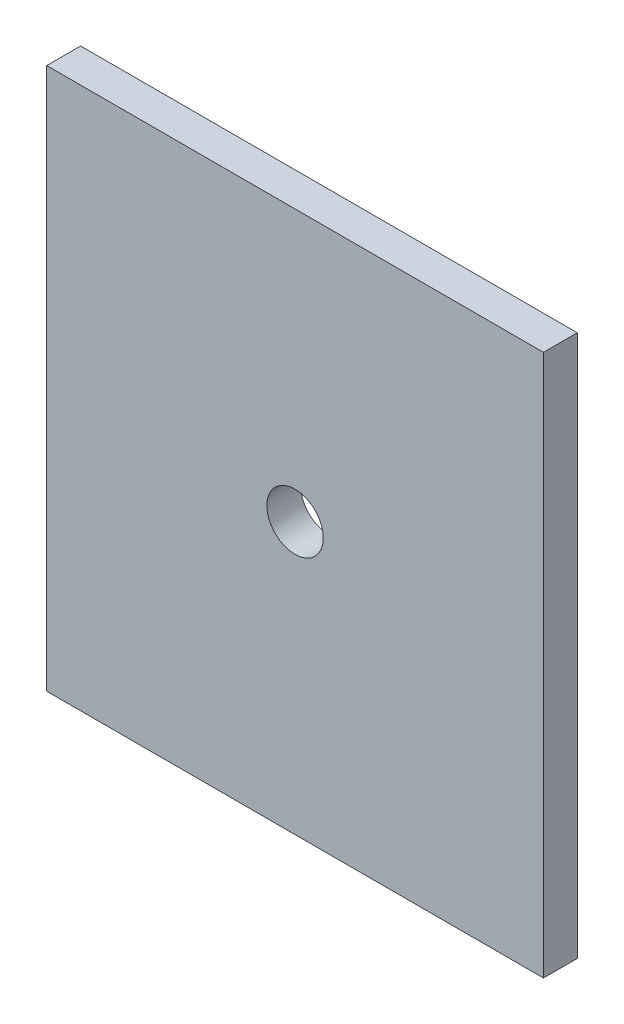
ISO-10303-21;
HEADER;
FILE_DESCRIPTION(('STEP AP214'),'2;1');
FILE_NAME('part.step','',(''),(''),'','','');
FILE_SCHEMA(('AUTOMOTIVE_DESIGN { 1 0 10303 214 1 1 1 1 }'));
ENDSEC;
DATA;
#1=APPLICATION_CONTEXT('core data for automotive mechanical design processes');
#2=APPLICATION_PROTOCOL_DEFINITION('international standard','automotive_design',2000,#1);
#3=PRODUCT_CONTEXT('',#1,'mechanical');
#4=PRODUCT('Part','Part','',(#3));
#5=PRODUCT_RELATED_PRODUCT_CATEGORY('part','',(#4));
#6=PRODUCT_DEFINITION_FORMATION('','',#4);
#7=PRODUCT_DEFINITION_CONTEXT('part definition',#1,'design');
#8=PRODUCT_DEFINITION('design','',#6,#7);
#9=PRODUCT_DEFINITION_SHAPE('','',#8);
#10=(LENGTH_UNIT() NAMED_UNIT(*) SI_UNIT(.MILLI.,.METRE.));
#11=(NAMED_UNIT(*) PLANE_ANGLE_UNIT() SI_UNIT($,.RADIAN.));
#12=(NAMED_UNIT(*) SI_UNIT($,.STERADIAN.) SOLID_ANGLE_UNIT());
#13=UNCERTAINTY_MEASURE_WITH_UNIT(LENGTH_MEASURE(1.E-05),#10,'distance_accuracy_value','');
#14=(GEOMETRIC_REPRESENTATION_CONTEXT(3) GLOBAL_UNCERTAINTY_ASSIGNED_CONTEXT((#13)) GLOBAL_UNIT_ASSIGNED_CONTEXT((#10,
#11,#12)) REPRESENTATION_CONTEXT('',''));
#15=CARTESIAN_POINT('',(0.,0.,0.));
#16=DIRECTION('',(0.,0.,1.));
#17=DIRECTION('',(1.,0.,0.));
#18=AXIS2_PLACEMENT_3D('',#15,#16,#17);
#19=CARTESIAN_POINT('',(-196.682719320133,-420.602297752566,-815.486147986319));
#20=DIRECTION('',(0.,0.,1.));
#21=DIRECTION('',(1.,0.,0.));
#22=AXIS2_PLACEMENT_3D('',#19,#20,#21);
#23=PLANE('',#22);
#24=CARTESIAN_POINT('',(-196.682719320133,-420.602297752566,-815.486147986319));
#25=DIRECTION('',(0.,0.,-1.));
#26=DIRECTION('',(-1.,0.,0.));
#27=AXIS2_PLACEMENT_3D('',#24,#25,#26);
#28=CIRCLE('',#27,12.5);
#29=CARTESIAN_POINT('',(-209.182719320133,-420.602297752566,-815.486147986319));
#30=VERTEX_POINT('',#29);
#31=EDGE_CURVE('E20',#30,#30,#28,.T.);
#32=ORIENTED_EDGE('',*,*,#31,.T.);
#33=EDGE_LOOP('',(#32));
#34=FACE_BOUND('',#33,.T.);
#35=DIRECTION('',(0.,1.,0.));
#36=VECTOR('',#35,1.);
#37=CARTESIAN_POINT('',(-306.682719320132,-420.602297752566,-815.486147986319));
#38=LINE('',#37,#36);
#39=CARTESIAN_POINT('',(-306.682719320132,-300.602297752566,-815.486147986319));
#40=VERTEX_POINT('',#39);
#41=CARTESIAN_POINT('',(-306.682719320132,-540.602297752566,-815.486147986319));
#42=VERTEX_POINT('',#41);
#43=EDGE_CURVE('E59',#40,#42,#38,.F.);
#44=ORIENTED_EDGE('',*,*,#43,.T.);
#45=DIRECTION('',(1.,0.,0.));
#46=VECTOR('',#45,1.);
#47=CARTESIAN_POINT('',(-196.682719320133,-540.602297752566,-815.486147986319));
#48=LINE('',#47,#46);
#49=CARTESIAN_POINT('',(-86.6827193201328,-540.602297752566,-815.486147986319));
#50=VERTEX_POINT('',#49);
#51=EDGE_CURVE('E54',#42,#50,#48,.T.);
#52=ORIENTED_EDGE('',*,*,#51,.T.);
#53=DIRECTION('',(0.,1.,0.));
#54=VECTOR('',#53,1.);
#55=CARTESIAN_POINT('',(-86.6827193201328,-420.602297752566,-815.486147986319));
#56=LINE('',#55,#54);
#57=CARTESIAN_POINT('',(-86.6827193201328,-300.602297752566,-815.486147986319));
#58=VERTEX_POINT('',#57);
#59=EDGE_CURVE('E72',#50,#58,#56,.T.);
#60=ORIENTED_EDGE('',*,*,#59,.T.);
#61=DIRECTION('',(1.,0.,0.));
#62=VECTOR('',#61,1.);
#63=CARTESIAN_POINT('',(-196.682719320133,-300.602297752566,-815.486147986319));
#64=LINE('',#63,#62);
#65=EDGE_CURVE('E69',#58,#40,#64,.F.);
#66=ORIENTED_EDGE('',*,*,#65,.T.);
#67=EDGE_LOOP('',(#44,#52,#60,#66));
#68=FACE_BOUND('',#67,.T.);
#69=ADVANCED_FACE('F17',(#34,#68),#23,.T.);
#70=CARTESIAN_POINT('',(-196.682719320133,-300.602297752566,-822.98614798632));
#71=DIRECTION('',(0.,-1.,0.));
#72=DIRECTION('',(0.,0.,-1.));
#73=AXIS2_PLACEMENT_3D('',#70,#71,#72);
#74=PLANE('',#73);
#75=DIRECTION('',(1.,0.,0.));
#76=VECTOR('',#75,1.);
#77=CARTESIAN_POINT('',(-196.682719320133,-300.602297752566,-830.48614798632));
#78=LINE('',#77,#76);
#79=CARTESIAN_POINT('',(-86.6827193201328,-300.602297752566,-830.48614798632));
#80=VERTEX_POINT('',#79);
#81=CARTESIAN_POINT('',(-306.682719320132,-300.602297752566,-830.48614798632));
#82=VERTEX_POINT('',#81);
#83=EDGE_CURVE('E80',#80,#82,#78,.F.);
#84=ORIENTED_EDGE('',*,*,#83,.T.);
#85=DIRECTION('',(0.,0.,-1.));
#86=VECTOR('',#85,1.);
#87=CARTESIAN_POINT('',(-306.682719320132,-300.602297752566,-822.98614798632));
#88=LINE('',#87,#86);
#89=EDGE_CURVE('E64',#82,#40,#88,.F.);
#90=ORIENTED_EDGE('',*,*,#89,.T.);
#91=ORIENTED_EDGE('',*,*,#65,.F.);
#92=DIRECTION('',(0.,0.,1.));
#93=VECTOR('',#92,1.);
#94=CARTESIAN_POINT('',(-86.6827193201328,-300.602297752566,-822.98614798632));
#95=LINE('',#94,#93);
#96=EDGE_CURVE('E93',#58,#80,#95,.F.);
#97=ORIENTED_EDGE('',*,*,#96,.T.);
#98=EDGE_LOOP('',(#84,#90,#91,#97));
#99=FACE_BOUND('',#98,.T.);
#100=ADVANCED_FACE('F79',(#99),#74,.F.);
#101=CARTESIAN_POINT('',(-306.682719320132,-420.602297752566,-822.98614798632));
#102=DIRECTION('',(1.,0.,0.));
#103=DIRECTION('',(0.,0.,-1.));
#104=AXIS2_PLACEMENT_3D('',#101,#102,#103);
#105=PLANE('',#104);
#106=DIRECTION('',(0.,1.,0.));
#107=VECTOR('',#106,1.);
#108=CARTESIAN_POINT('',(-306.682719320132,-420.602297752566,-830.48614798632));
#109=LINE('',#108,#107);
#110=CARTESIAN_POINT('',(-306.682719320132,-540.602297752566,-830.48614798632));
#111=VERTEX_POINT('',#110);
#112=EDGE_CURVE('E99',#82,#111,#109,.F.);
#113=ORIENTED_EDGE('',*,*,#112,.T.);
#114=DIRECTION('',(0.,0.,1.));
#115=VECTOR('',#114,1.);
#116=CARTESIAN_POINT('',(-306.682719320132,-540.602297752566,-822.98614798632));
#117=LINE('',#116,#115);
#118=EDGE_CURVE('E66',#111,#42,#117,.T.);
#119=ORIENTED_EDGE('',*,*,#118,.T.);
#120=ORIENTED_EDGE('',*,*,#43,.F.);
#121=ORIENTED_EDGE('',*,*,#89,.F.);
#122=EDGE_LOOP('',(#113,#119,#120,#121));
#123=FACE_BOUND('',#122,.T.);
#124=ADVANCED_FACE('F62',(#123),#105,.F.);
#125=CARTESIAN_POINT('',(-196.682719320133,-540.602297752566,-822.98614798632));
#126=DIRECTION('',(0.,1.,0.));
#127=DIRECTION('',(0.,0.,1.));
#128=AXIS2_PLACEMENT_3D('',#125,#126,#127);
#129=PLANE('',#128);
#130=DIRECTION('',(1.,0.,0.));
#131=VECTOR('',#130,1.);
#132=CARTESIAN_POINT('',(-196.682719320133,-540.602297752566,-830.48614798632));
#133=LINE('',#132,#131);
#134=CARTESIAN_POINT('',(-86.6827193201328,-540.602297752566,-830.48614798632));
#135=VERTEX_POINT('',#134);
#136=EDGE_CURVE('E102',#111,#135,#133,.T.);
#137=ORIENTED_EDGE('',*,*,#136,.T.);
#138=DIRECTION('',(0.,0.,1.));
#139=VECTOR('',#138,1.);
#140=CARTESIAN_POINT('',(-86.6827193201328,-540.602297752566,-822.98614798632));
#141=LINE('',#140,#139);
#142=EDGE_CURVE('E35',#135,#50,#141,.T.);
#143=ORIENTED_EDGE('',*,*,#142,.T.);
#144=ORIENTED_EDGE('',*,*,#51,.F.);
#145=ORIENTED_EDGE('',*,*,#118,.F.);
#146=EDGE_LOOP('',(#137,#143,#144,#145));
#147=FACE_BOUND('',#146,.T.);
#148=ADVANCED_FACE('F111',(#147),#129,.F.);
#149=CARTESIAN_POINT('',(-86.6827193201328,-420.602297752566,-822.98614798632));
#150=DIRECTION('',(-1.,0.,0.));
#151=DIRECTION('',(0.,0.,1.));
#152=AXIS2_PLACEMENT_3D('',#149,#150,#151);
#153=PLANE('',#152);
#154=DIRECTION('',(0.,1.,0.));
#155=VECTOR('',#154,1.);
#156=CARTESIAN_POINT('',(-86.6827193201328,-420.602297752566,-830.48614798632));
#157=LINE('',#156,#155);
#158=EDGE_CURVE('E27',#135,#80,#157,.T.);
#159=ORIENTED_EDGE('',*,*,#158,.T.);
#160=ORIENTED_EDGE('',*,*,#96,.F.);
#161=ORIENTED_EDGE('',*,*,#59,.F.);
#162=ORIENTED_EDGE('',*,*,#142,.F.);
#163=EDGE_LOOP('',(#159,#160,#161,#162));
#164=FACE_BOUND('',#163,.T.);
#165=ADVANCED_FACE('F107',(#164),#153,.F.);
#166=CARTESIAN_POINT('',(-196.682719320133,-420.602297752566,-815.486147986319));
#167=DIRECTION('',(0.,0.,-1.));
#168=DIRECTION('',(-1.,0.,0.));
#169=AXIS2_PLACEMENT_3D('',#166,#167,#168);
#170=CYLINDRICAL_SURFACE('',#169,12.5);
#171=ORIENTED_EDGE('',*,*,#31,.F.);
#172=EDGE_LOOP('',(#171));
#173=FACE_BOUND('',#172,.T.);
#174=CARTESIAN_POINT('',(-196.682719320133,-420.602297752566,-830.48614798632));
#175=DIRECTION('',(0.,0.,-1.));
#176=DIRECTION('',(-1.,0.,0.));
#177=AXIS2_PLACEMENT_3D('',#174,#175,#176);
#178=CIRCLE('',#177,12.5);
#179=CARTESIAN_POINT('',(-209.182719320133,-420.602297752566,-830.48614798632));
#180=VERTEX_POINT('',#179);
#181=EDGE_CURVE('E11',#180,#180,#178,.T.);
#182=ORIENTED_EDGE('',*,*,#181,.T.);
#183=EDGE_LOOP('',(#182));
#184=FACE_BOUND('',#183,.T.);
#185=ADVANCED_FACE('F118',(#173,#184),#170,.F.);
#186=CARTESIAN_POINT('',(-196.682719320133,-420.602297752566,-830.48614798632));
#187=DIRECTION('',(0.,0.,1.));
#188=DIRECTION('',(1.,0.,0.));
#189=AXIS2_PLACEMENT_3D('',#186,#187,#188);
#190=PLANE('',#189);
#191=ORIENTED_EDGE('',*,*,#181,.F.);
#192=EDGE_LOOP('',(#191));
#193=FACE_BOUND('',#192,.T.);
#194=ORIENTED_EDGE('',*,*,#136,.F.);
#195=ORIENTED_EDGE('',*,*,#112,.F.);
#196=ORIENTED_EDGE('',*,*,#83,.F.);
#197=ORIENTED_EDGE('',*,*,#158,.F.);
#198=EDGE_LOOP('',(#194,#195,#196,#197));
#199=FACE_BOUND('',#198,.T.);
#200=ADVANCED_FACE('F110',(#193,#199),#190,.F.);
#201=CLOSED_SHELL('',(#69,#100,#124,#148,#165,#185,#200));
#202=MANIFOLD_SOLID_BREP('B1',#201);
#203=ADVANCED_BREP_SHAPE_REPRESENTATION('',(#18,#202),#14);
#204=SHAPE_DEFINITION_REPRESENTATION(#9,#203);
ENDSEC;
END-ISO-10303-21;
